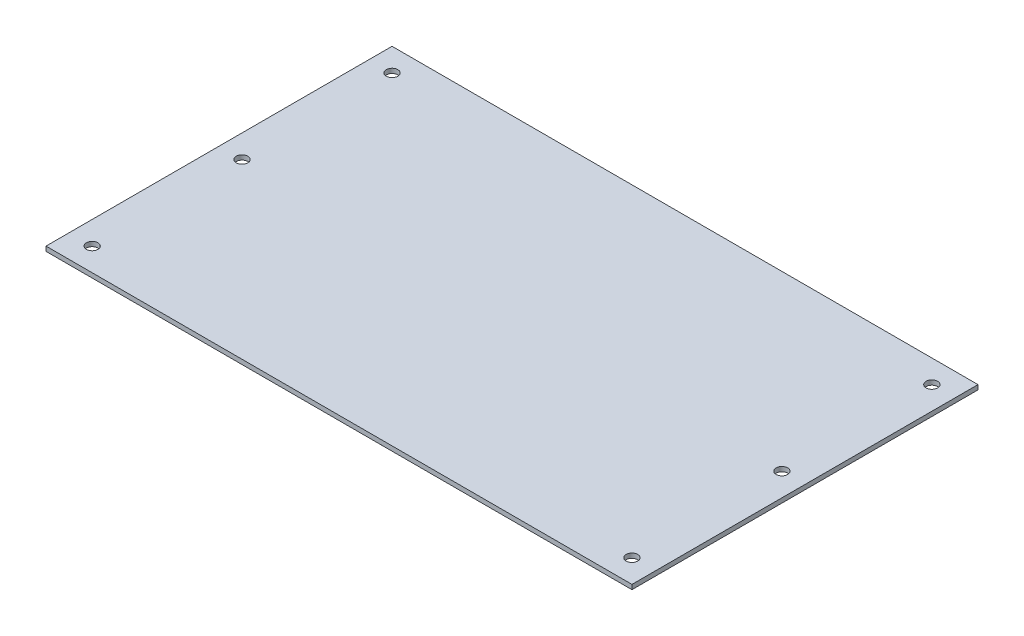
ISO-10303-21;
HEADER;
FILE_DESCRIPTION(('STEP AP214'),'2;1');
FILE_NAME('part.step','',(''),(''),'','','');
FILE_SCHEMA(('AUTOMOTIVE_DESIGN { 1 0 10303 214 1 1 1 1 }'));
ENDSEC;
DATA;
#1=APPLICATION_CONTEXT('core data for automotive mechanical design processes');
#2=APPLICATION_PROTOCOL_DEFINITION('international standard','automotive_design',2000,#1);
#3=PRODUCT_CONTEXT('',#1,'mechanical');
#4=PRODUCT('Part','Part','',(#3));
#5=PRODUCT_RELATED_PRODUCT_CATEGORY('part','',(#4));
#6=PRODUCT_DEFINITION_FORMATION('','',#4);
#7=PRODUCT_DEFINITION_CONTEXT('part definition',#1,'design');
#8=PRODUCT_DEFINITION('design','',#6,#7);
#9=PRODUCT_DEFINITION_SHAPE('','',#8);
#10=(LENGTH_UNIT() NAMED_UNIT(*) SI_UNIT(.MILLI.,.METRE.));
#11=(NAMED_UNIT(*) PLANE_ANGLE_UNIT() SI_UNIT($,.RADIAN.));
#12=(NAMED_UNIT(*) SI_UNIT($,.STERADIAN.) SOLID_ANGLE_UNIT());
#13=UNCERTAINTY_MEASURE_WITH_UNIT(LENGTH_MEASURE(1.E-05),#10,'distance_accuracy_value','');
#14=(GEOMETRIC_REPRESENTATION_CONTEXT(3) GLOBAL_UNCERTAINTY_ASSIGNED_CONTEXT((#13)) GLOBAL_UNIT_ASSIGNED_CONTEXT((#10,
#11,#12)) REPRESENTATION_CONTEXT('',''));
#15=CARTESIAN_POINT('',(0.,0.,0.));
#16=DIRECTION('',(0.,0.,1.));
#17=DIRECTION('',(1.,0.,0.));
#18=AXIS2_PLACEMENT_3D('',#15,#16,#17);
#19=CARTESIAN_POINT('',(127.,2.,0.));
#20=DIRECTION('',(1.,0.,0.));
#21=DIRECTION('',(0.,0.,-1.));
#22=AXIS2_PLACEMENT_3D('',#19,#20,#21);
#23=PLANE('',#22);
#24=DIRECTION('',(0.,0.,1.));
#25=VECTOR('',#24,1.);
#26=CARTESIAN_POINT('',(127.,0.,0.));
#27=LINE('',#26,#25);
#28=CARTESIAN_POINT('',(127.,0.,-75.));
#29=VERTEX_POINT('',#28);
#30=CARTESIAN_POINT('',(127.,0.,75.));
#31=VERTEX_POINT('',#30);
#32=EDGE_CURVE('E123',#29,#31,#27,.T.);
#33=ORIENTED_EDGE('',*,*,#32,.F.);
#34=DIRECTION('',(0.,-1.,0.));
#35=VECTOR('',#34,1.);
#36=CARTESIAN_POINT('',(127.,2.,-75.));
#37=LINE('',#36,#35);
#38=CARTESIAN_POINT('',(127.,2.,-75.));
#39=VERTEX_POINT('',#38);
#40=EDGE_CURVE('E11',#39,#29,#37,.T.);
#41=ORIENTED_EDGE('',*,*,#40,.F.);
#42=DIRECTION('',(0.,0.,1.));
#43=VECTOR('',#42,1.);
#44=CARTESIAN_POINT('',(127.,2.,0.));
#45=LINE('',#44,#43);
#46=CARTESIAN_POINT('',(127.,2.,75.));
#47=VERTEX_POINT('',#46);
#48=EDGE_CURVE('E95',#39,#47,#45,.T.);
#49=ORIENTED_EDGE('',*,*,#48,.T.);
#50=DIRECTION('',(0.,-1.,0.));
#51=VECTOR('',#50,1.);
#52=CARTESIAN_POINT('',(127.,2.,75.));
#53=LINE('',#52,#51);
#54=EDGE_CURVE('E53',#47,#31,#53,.T.);
#55=ORIENTED_EDGE('',*,*,#54,.T.);
#56=EDGE_LOOP('',(#33,#41,#49,#55));
#57=FACE_BOUND('',#56,.T.);
#58=ADVANCED_FACE('F36',(#57),#23,.T.);
#59=CARTESIAN_POINT('',(0.,2.,-75.));
#60=DIRECTION('',(0.,0.,-1.));
#61=DIRECTION('',(-1.,0.,0.));
#62=AXIS2_PLACEMENT_3D('',#59,#60,#61);
#63=PLANE('',#62);
#64=DIRECTION('',(1.,0.,0.));
#65=VECTOR('',#64,1.);
#66=CARTESIAN_POINT('',(0.,0.,-75.));
#67=LINE('',#66,#65);
#68=CARTESIAN_POINT('',(-127.,0.,-75.));
#69=VERTEX_POINT('',#68);
#70=EDGE_CURVE('E85',#69,#29,#67,.T.);
#71=ORIENTED_EDGE('',*,*,#70,.F.);
#72=DIRECTION('',(0.,-1.,0.));
#73=VECTOR('',#72,1.);
#74=CARTESIAN_POINT('',(-127.,2.,-75.));
#75=LINE('',#74,#73);
#76=CARTESIAN_POINT('',(-127.,2.,-75.));
#77=VERTEX_POINT('',#76);
#78=EDGE_CURVE('E45',#77,#69,#75,.T.);
#79=ORIENTED_EDGE('',*,*,#78,.F.);
#80=DIRECTION('',(1.,0.,0.));
#81=VECTOR('',#80,1.);
#82=CARTESIAN_POINT('',(0.,2.,-75.));
#83=LINE('',#82,#81);
#84=EDGE_CURVE('E83',#77,#39,#83,.T.);
#85=ORIENTED_EDGE('',*,*,#84,.T.);
#86=ORIENTED_EDGE('',*,*,#40,.T.);
#87=EDGE_LOOP('',(#71,#79,#85,#86));
#88=FACE_BOUND('',#87,.T.);
#89=ADVANCED_FACE('F81',(#88),#63,.T.);
#90=CARTESIAN_POINT('',(-127.,2.,0.));
#91=DIRECTION('',(1.,0.,0.));
#92=DIRECTION('',(0.,0.,-1.));
#93=AXIS2_PLACEMENT_3D('',#90,#91,#92);
#94=PLANE('',#93);
#95=DIRECTION('',(0.,0.,1.));
#96=VECTOR('',#95,1.);
#97=CARTESIAN_POINT('',(-127.,0.,0.));
#98=LINE('',#97,#96);
#99=CARTESIAN_POINT('',(-127.,0.,75.));
#100=VERTEX_POINT('',#99);
#101=EDGE_CURVE('E126',#69,#100,#98,.T.);
#102=ORIENTED_EDGE('',*,*,#101,.T.);
#103=DIRECTION('',(0.,-1.,0.));
#104=VECTOR('',#103,1.);
#105=CARTESIAN_POINT('',(-127.,2.,75.));
#106=LINE('',#105,#104);
#107=CARTESIAN_POINT('',(-127.,2.,75.));
#108=VERTEX_POINT('',#107);
#109=EDGE_CURVE('E67',#108,#100,#106,.T.);
#110=ORIENTED_EDGE('',*,*,#109,.F.);
#111=DIRECTION('',(0.,0.,1.));
#112=VECTOR('',#111,1.);
#113=CARTESIAN_POINT('',(-127.,2.,0.));
#114=LINE('',#113,#112);
#115=EDGE_CURVE('E88',#77,#108,#114,.T.);
#116=ORIENTED_EDGE('',*,*,#115,.F.);
#117=ORIENTED_EDGE('',*,*,#78,.T.);
#118=EDGE_LOOP('',(#102,#110,#116,#117));
#119=FACE_BOUND('',#118,.T.);
#120=ADVANCED_FACE('F89',(#119),#94,.F.);
#121=CARTESIAN_POINT('',(-117.,2.,0.));
#122=DIRECTION('',(0.,-1.,0.));
#123=DIRECTION('',(0.,0.,-1.));
#124=AXIS2_PLACEMENT_3D('',#121,#122,#123);
#125=CYLINDRICAL_SURFACE('',#124,2.5);
#126=CARTESIAN_POINT('',(-117.,2.,0.));
#127=DIRECTION('',(0.,1.,0.));
#128=DIRECTION('',(0.,0.,1.));
#129=AXIS2_PLACEMENT_3D('',#126,#127,#128);
#130=CIRCLE('',#129,2.5);
#131=CARTESIAN_POINT('',(-117.,2.,2.50000000000001));
#132=VERTEX_POINT('',#131);
#133=EDGE_CURVE('E99',#132,#132,#130,.T.);
#134=ORIENTED_EDGE('',*,*,#133,.T.);
#135=EDGE_LOOP('',(#134));
#136=FACE_BOUND('',#135,.T.);
#137=CARTESIAN_POINT('',(-117.,0.,0.));
#138=DIRECTION('',(0.,1.,0.));
#139=DIRECTION('',(0.,0.,1.));
#140=AXIS2_PLACEMENT_3D('',#137,#138,#139);
#141=CIRCLE('',#140,2.5);
#142=CARTESIAN_POINT('',(-117.,0.,2.50000000000001));
#143=VERTEX_POINT('',#142);
#144=EDGE_CURVE('E120',#143,#143,#141,.T.);
#145=ORIENTED_EDGE('',*,*,#144,.F.);
#146=EDGE_LOOP('',(#145));
#147=FACE_BOUND('',#146,.T.);
#148=ADVANCED_FACE('F154',(#136,#147),#125,.F.);
#149=CARTESIAN_POINT('',(-117.,2.,-65.));
#150=DIRECTION('',(0.,-1.,0.));
#151=DIRECTION('',(0.,0.,-1.));
#152=AXIS2_PLACEMENT_3D('',#149,#150,#151);
#153=CYLINDRICAL_SURFACE('',#152,2.50000000000001);
#154=CARTESIAN_POINT('',(-117.,2.,-65.));
#155=DIRECTION('',(0.,1.,0.));
#156=DIRECTION('',(0.,0.,1.));
#157=AXIS2_PLACEMENT_3D('',#154,#155,#156);
#158=CIRCLE('',#157,2.50000000000001);
#159=CARTESIAN_POINT('',(-117.,2.,-62.5));
#160=VERTEX_POINT('',#159);
#161=EDGE_CURVE('E149',#160,#160,#158,.T.);
#162=ORIENTED_EDGE('',*,*,#161,.T.);
#163=EDGE_LOOP('',(#162));
#164=FACE_BOUND('',#163,.T.);
#165=CARTESIAN_POINT('',(-117.,0.,-65.));
#166=DIRECTION('',(0.,1.,0.));
#167=DIRECTION('',(0.,0.,1.));
#168=AXIS2_PLACEMENT_3D('',#165,#166,#167);
#169=CIRCLE('',#168,2.50000000000001);
#170=CARTESIAN_POINT('',(-117.,0.,-62.5));
#171=VERTEX_POINT('',#170);
#172=EDGE_CURVE('E117',#171,#171,#169,.T.);
#173=ORIENTED_EDGE('',*,*,#172,.F.);
#174=EDGE_LOOP('',(#173));
#175=FACE_BOUND('',#174,.T.);
#176=ADVANCED_FACE('F180',(#164,#175),#153,.F.);
#177=CARTESIAN_POINT('',(-117.,2.,65.));
#178=DIRECTION('',(0.,-1.,0.));
#179=DIRECTION('',(0.,0.,-1.));
#180=AXIS2_PLACEMENT_3D('',#177,#178,#179);
#181=CYLINDRICAL_SURFACE('',#180,2.50000000000001);
#182=CARTESIAN_POINT('',(-117.,2.,65.));
#183=DIRECTION('',(0.,1.,0.));
#184=DIRECTION('',(0.,0.,1.));
#185=AXIS2_PLACEMENT_3D('',#182,#183,#184);
#186=CIRCLE('',#185,2.50000000000001);
#187=CARTESIAN_POINT('',(-117.,2.,67.5));
#188=VERTEX_POINT('',#187);
#189=EDGE_CURVE('E146',#188,#188,#186,.T.);
#190=ORIENTED_EDGE('',*,*,#189,.T.);
#191=EDGE_LOOP('',(#190));
#192=FACE_BOUND('',#191,.T.);
#193=CARTESIAN_POINT('',(-117.,0.,65.));
#194=DIRECTION('',(0.,1.,0.));
#195=DIRECTION('',(0.,0.,1.));
#196=AXIS2_PLACEMENT_3D('',#193,#194,#195);
#197=CIRCLE('',#196,2.50000000000001);
#198=CARTESIAN_POINT('',(-117.,0.,67.5));
#199=VERTEX_POINT('',#198);
#200=EDGE_CURVE('E114',#199,#199,#197,.T.);
#201=ORIENTED_EDGE('',*,*,#200,.F.);
#202=EDGE_LOOP('',(#201));
#203=FACE_BOUND('',#202,.T.);
#204=ADVANCED_FACE('F183',(#192,#203),#181,.F.);
#205=CARTESIAN_POINT('',(117.,2.,65.));
#206=DIRECTION('',(0.,-1.,0.));
#207=DIRECTION('',(0.,0.,-1.));
#208=AXIS2_PLACEMENT_3D('',#205,#206,#207);
#209=CYLINDRICAL_SURFACE('',#208,2.5);
#210=CARTESIAN_POINT('',(117.,2.,65.));
#211=DIRECTION('',(0.,1.,0.));
#212=DIRECTION('',(0.,0.,1.));
#213=AXIS2_PLACEMENT_3D('',#210,#211,#212);
#214=CIRCLE('',#213,2.5);
#215=CARTESIAN_POINT('',(117.,2.,67.5));
#216=VERTEX_POINT('',#215);
#217=EDGE_CURVE('E141',#216,#216,#214,.T.);
#218=ORIENTED_EDGE('',*,*,#217,.T.);
#219=EDGE_LOOP('',(#218));
#220=FACE_BOUND('',#219,.T.);
#221=CARTESIAN_POINT('',(117.,0.,65.));
#222=DIRECTION('',(0.,1.,0.));
#223=DIRECTION('',(0.,0.,1.));
#224=AXIS2_PLACEMENT_3D('',#221,#222,#223);
#225=CIRCLE('',#224,2.5);
#226=CARTESIAN_POINT('',(117.,0.,67.5));
#227=VERTEX_POINT('',#226);
#228=EDGE_CURVE('E111',#227,#227,#225,.T.);
#229=ORIENTED_EDGE('',*,*,#228,.F.);
#230=EDGE_LOOP('',(#229));
#231=FACE_BOUND('',#230,.T.);
#232=ADVANCED_FACE('F187',(#220,#231),#209,.F.);
#233=CARTESIAN_POINT('',(117.,2.,0.));
#234=DIRECTION('',(0.,-1.,0.));
#235=DIRECTION('',(0.,0.,-1.));
#236=AXIS2_PLACEMENT_3D('',#233,#234,#235);
#237=CYLINDRICAL_SURFACE('',#236,2.5);
#238=CARTESIAN_POINT('',(117.,2.,0.));
#239=DIRECTION('',(0.,1.,0.));
#240=DIRECTION('',(0.,0.,1.));
#241=AXIS2_PLACEMENT_3D('',#238,#239,#240);
#242=CIRCLE('',#241,2.5);
#243=CARTESIAN_POINT('',(117.,2.,2.50000000000001));
#244=VERTEX_POINT('',#243);
#245=EDGE_CURVE('E136',#244,#244,#242,.T.);
#246=ORIENTED_EDGE('',*,*,#245,.T.);
#247=EDGE_LOOP('',(#246));
#248=FACE_BOUND('',#247,.T.);
#249=CARTESIAN_POINT('',(117.,0.,0.));
#250=DIRECTION('',(0.,1.,0.));
#251=DIRECTION('',(0.,0.,1.));
#252=AXIS2_PLACEMENT_3D('',#249,#250,#251);
#253=CIRCLE('',#252,2.5);
#254=CARTESIAN_POINT('',(117.,0.,2.50000000000001));
#255=VERTEX_POINT('',#254);
#256=EDGE_CURVE('E108',#255,#255,#253,.T.);
#257=ORIENTED_EDGE('',*,*,#256,.F.);
#258=EDGE_LOOP('',(#257));
#259=FACE_BOUND('',#258,.T.);
#260=ADVANCED_FACE('F190',(#248,#259),#237,.F.);
#261=CARTESIAN_POINT('',(117.,2.,-65.));
#262=DIRECTION('',(0.,-1.,0.));
#263=DIRECTION('',(0.,0.,-1.));
#264=AXIS2_PLACEMENT_3D('',#261,#262,#263);
#265=CYLINDRICAL_SURFACE('',#264,2.50000000000001);
#266=CARTESIAN_POINT('',(117.,2.,-65.));
#267=DIRECTION('',(0.,1.,0.));
#268=DIRECTION('',(0.,0.,1.));
#269=AXIS2_PLACEMENT_3D('',#266,#267,#268);
#270=CIRCLE('',#269,2.50000000000001);
#271=CARTESIAN_POINT('',(117.,2.,-62.5));
#272=VERTEX_POINT('',#271);
#273=EDGE_CURVE('E132',#272,#272,#270,.T.);
#274=ORIENTED_EDGE('',*,*,#273,.T.);
#275=EDGE_LOOP('',(#274));
#276=FACE_BOUND('',#275,.T.);
#277=CARTESIAN_POINT('',(117.,0.,-65.));
#278=DIRECTION('',(0.,1.,0.));
#279=DIRECTION('',(0.,0.,1.));
#280=AXIS2_PLACEMENT_3D('',#277,#278,#279);
#281=CIRCLE('',#280,2.50000000000001);
#282=CARTESIAN_POINT('',(117.,0.,-62.5));
#283=VERTEX_POINT('',#282);
#284=EDGE_CURVE('E105',#283,#283,#281,.T.);
#285=ORIENTED_EDGE('',*,*,#284,.F.);
#286=EDGE_LOOP('',(#285));
#287=FACE_BOUND('',#286,.T.);
#288=ADVANCED_FACE('F38',(#276,#287),#265,.F.);
#289=CARTESIAN_POINT('',(0.,2.,75.));
#290=DIRECTION('',(0.,0.,1.));
#291=DIRECTION('',(1.,0.,0.));
#292=AXIS2_PLACEMENT_3D('',#289,#290,#291);
#293=PLANE('',#292);
#294=DIRECTION('',(-1.,0.,0.));
#295=VECTOR('',#294,1.);
#296=CARTESIAN_POINT('',(0.,0.,75.));
#297=LINE('',#296,#295);
#298=EDGE_CURVE('E128',#31,#100,#297,.T.);
#299=ORIENTED_EDGE('',*,*,#298,.F.);
#300=ORIENTED_EDGE('',*,*,#54,.F.);
#301=DIRECTION('',(-1.,0.,0.));
#302=VECTOR('',#301,1.);
#303=CARTESIAN_POINT('',(0.,2.,75.));
#304=LINE('',#303,#302);
#305=EDGE_CURVE('E92',#47,#108,#304,.T.);
#306=ORIENTED_EDGE('',*,*,#305,.T.);
#307=ORIENTED_EDGE('',*,*,#109,.T.);
#308=EDGE_LOOP('',(#299,#300,#306,#307));
#309=FACE_BOUND('',#308,.T.);
#310=ADVANCED_FACE('F159',(#309),#293,.T.);
#311=CARTESIAN_POINT('',(0.,2.,0.));
#312=DIRECTION('',(0.,1.,0.));
#313=DIRECTION('',(0.,0.,1.));
#314=AXIS2_PLACEMENT_3D('',#311,#312,#313);
#315=PLANE('',#314);
#316=ORIENTED_EDGE('',*,*,#273,.F.);
#317=EDGE_LOOP('',(#316));
#318=FACE_BOUND('',#317,.T.);
#319=ORIENTED_EDGE('',*,*,#245,.F.);
#320=EDGE_LOOP('',(#319));
#321=FACE_BOUND('',#320,.T.);
#322=ORIENTED_EDGE('',*,*,#217,.F.);
#323=EDGE_LOOP('',(#322));
#324=FACE_BOUND('',#323,.T.);
#325=ORIENTED_EDGE('',*,*,#189,.F.);
#326=EDGE_LOOP('',(#325));
#327=FACE_BOUND('',#326,.T.);
#328=ORIENTED_EDGE('',*,*,#161,.F.);
#329=EDGE_LOOP('',(#328));
#330=FACE_BOUND('',#329,.T.);
#331=ORIENTED_EDGE('',*,*,#133,.F.);
#332=EDGE_LOOP('',(#331));
#333=FACE_BOUND('',#332,.T.);
#334=ORIENTED_EDGE('',*,*,#48,.F.);
#335=ORIENTED_EDGE('',*,*,#84,.F.);
#336=ORIENTED_EDGE('',*,*,#115,.T.);
#337=ORIENTED_EDGE('',*,*,#305,.F.);
#338=EDGE_LOOP('',(#334,#335,#336,#337));
#339=FACE_BOUND('',#338,.T.);
#340=ADVANCED_FACE('F94',(#318,#321,#324,#327,#330,#333,#339),#315,.T.);
#341=CARTESIAN_POINT('',(0.,0.,0.));
#342=DIRECTION('',(0.,1.,0.));
#343=DIRECTION('',(0.,0.,1.));
#344=AXIS2_PLACEMENT_3D('',#341,#342,#343);
#345=PLANE('',#344);
#346=ORIENTED_EDGE('',*,*,#284,.T.);
#347=EDGE_LOOP('',(#346));
#348=FACE_BOUND('',#347,.T.);
#349=ORIENTED_EDGE('',*,*,#256,.T.);
#350=EDGE_LOOP('',(#349));
#351=FACE_BOUND('',#350,.T.);
#352=ORIENTED_EDGE('',*,*,#228,.T.);
#353=EDGE_LOOP('',(#352));
#354=FACE_BOUND('',#353,.T.);
#355=ORIENTED_EDGE('',*,*,#200,.T.);
#356=EDGE_LOOP('',(#355));
#357=FACE_BOUND('',#356,.T.);
#358=ORIENTED_EDGE('',*,*,#172,.T.);
#359=EDGE_LOOP('',(#358));
#360=FACE_BOUND('',#359,.T.);
#361=ORIENTED_EDGE('',*,*,#144,.T.);
#362=EDGE_LOOP('',(#361));
#363=FACE_BOUND('',#362,.T.);
#364=ORIENTED_EDGE('',*,*,#32,.T.);
#365=ORIENTED_EDGE('',*,*,#298,.T.);
#366=ORIENTED_EDGE('',*,*,#101,.F.);
#367=ORIENTED_EDGE('',*,*,#70,.T.);
#368=EDGE_LOOP('',(#364,#365,#366,#367));
#369=FACE_BOUND('',#368,.T.);
#370=ADVANCED_FACE('F158',(#348,#351,#354,#357,#360,#363,#369),#345,.F.);
#371=CLOSED_SHELL('',(#58,#89,#120,#148,#176,#204,#232,#260,#288,#310,#340,#370));
#372=MANIFOLD_SOLID_BREP('B2',#371);
#373=ADVANCED_BREP_SHAPE_REPRESENTATION('',(#18,#372),#14);
#374=SHAPE_DEFINITION_REPRESENTATION(#9,#373);
ENDSEC;
END-ISO-10303-21;
